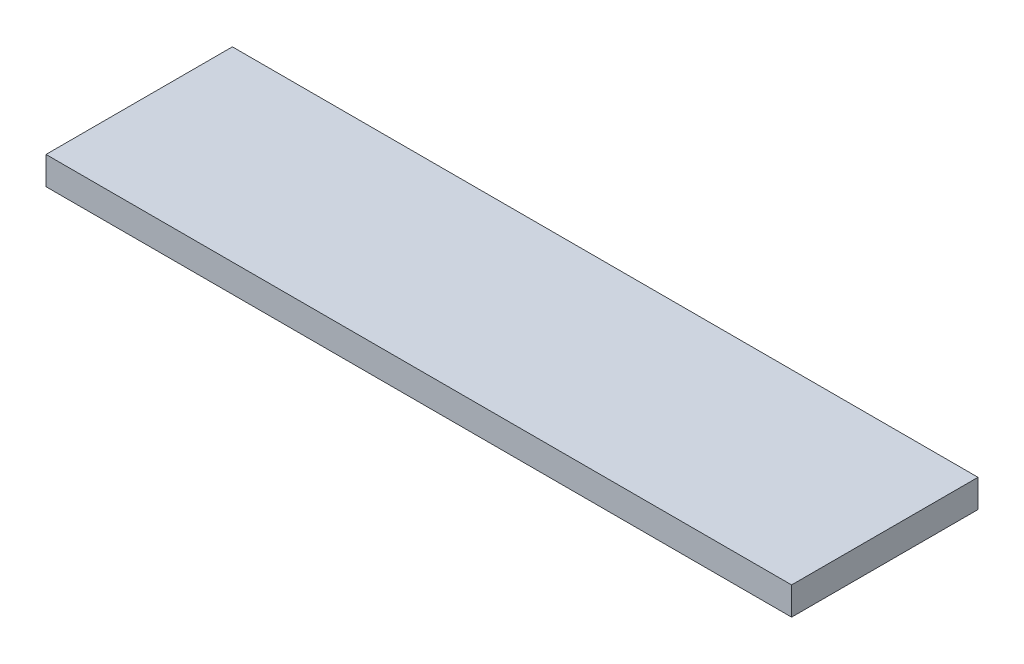
ISO-10303-21;
HEADER;
FILE_DESCRIPTION(('STEP AP214'),'2;1');
FILE_NAME('part.step','',(''),(''),'','','');
FILE_SCHEMA(('AUTOMOTIVE_DESIGN { 1 0 10303 214 1 1 1 1 }'));
ENDSEC;
DATA;
#1=APPLICATION_CONTEXT('core data for automotive mechanical design processes');
#2=APPLICATION_PROTOCOL_DEFINITION('international standard','automotive_design',2000,#1);
#3=PRODUCT_CONTEXT('',#1,'mechanical');
#4=PRODUCT('Part','Part','',(#3));
#5=PRODUCT_RELATED_PRODUCT_CATEGORY('part','',(#4));
#6=PRODUCT_DEFINITION_FORMATION('','',#4);
#7=PRODUCT_DEFINITION_CONTEXT('part definition',#1,'design');
#8=PRODUCT_DEFINITION('design','',#6,#7);
#9=PRODUCT_DEFINITION_SHAPE('','',#8);
#10=(LENGTH_UNIT() NAMED_UNIT(*) SI_UNIT(.MILLI.,.METRE.));
#11=(NAMED_UNIT(*) PLANE_ANGLE_UNIT() SI_UNIT($,.RADIAN.));
#12=(NAMED_UNIT(*) SI_UNIT($,.STERADIAN.) SOLID_ANGLE_UNIT());
#13=UNCERTAINTY_MEASURE_WITH_UNIT(LENGTH_MEASURE(1.E-05),#10,'distance_accuracy_value','');
#14=(GEOMETRIC_REPRESENTATION_CONTEXT(3) GLOBAL_UNCERTAINTY_ASSIGNED_CONTEXT((#13)) GLOBAL_UNIT_ASSIGNED_CONTEXT((#10,
#11,#12)) REPRESENTATION_CONTEXT('',''));
#15=CARTESIAN_POINT('',(0.,0.,0.));
#16=DIRECTION('',(0.,0.,1.));
#17=DIRECTION('',(1.,0.,0.));
#18=AXIS2_PLACEMENT_3D('',#15,#16,#17);
#19=CARTESIAN_POINT('',(-200.,15.,50.));
#20=DIRECTION('',(1.,0.,0.));
#21=DIRECTION('',(0.,0.,-1.));
#22=AXIS2_PLACEMENT_3D('',#19,#20,#21);
#23=PLANE('',#22);
#24=DIRECTION('',(0.,0.,1.));
#25=VECTOR('',#24,1.);
#26=CARTESIAN_POINT('',(-200.,0.,50.));
#27=LINE('',#26,#25);
#28=CARTESIAN_POINT('',(-200.,0.,-50.));
#29=VERTEX_POINT('',#28);
#30=CARTESIAN_POINT('',(-200.,0.,50.));
#31=VERTEX_POINT('',#30);
#32=EDGE_CURVE('E100',#29,#31,#27,.T.);
#33=ORIENTED_EDGE('',*,*,#32,.T.);
#34=DIRECTION('',(0.,-1.,0.));
#35=VECTOR('',#34,1.);
#36=CARTESIAN_POINT('',(-200.,15.,50.));
#37=LINE('',#36,#35);
#38=CARTESIAN_POINT('',(-200.,15.,50.));
#39=VERTEX_POINT('',#38);
#40=EDGE_CURVE('E11',#39,#31,#37,.T.);
#41=ORIENTED_EDGE('',*,*,#40,.F.);
#42=DIRECTION('',(0.,0.,1.));
#43=VECTOR('',#42,1.);
#44=CARTESIAN_POINT('',(-200.,15.,50.));
#45=LINE('',#44,#43);
#46=CARTESIAN_POINT('',(-200.,15.,-50.));
#47=VERTEX_POINT('',#46);
#48=EDGE_CURVE('E88',#47,#39,#45,.T.);
#49=ORIENTED_EDGE('',*,*,#48,.F.);
#50=DIRECTION('',(0.,-1.,0.));
#51=VECTOR('',#50,1.);
#52=CARTESIAN_POINT('',(-200.,15.,-50.));
#53=LINE('',#52,#51);
#54=EDGE_CURVE('E96',#47,#29,#53,.T.);
#55=ORIENTED_EDGE('',*,*,#54,.T.);
#56=EDGE_LOOP('',(#33,#41,#49,#55));
#57=FACE_BOUND('',#56,.T.);
#58=ADVANCED_FACE('F37',(#57),#23,.F.);
#59=CARTESIAN_POINT('',(200.,15.,50.));
#60=DIRECTION('',(0.,0.,-1.));
#61=DIRECTION('',(-1.,0.,0.));
#62=AXIS2_PLACEMENT_3D('',#59,#60,#61);
#63=PLANE('',#62);
#64=DIRECTION('',(1.,0.,0.));
#65=VECTOR('',#64,1.);
#66=CARTESIAN_POINT('',(200.,0.,50.));
#67=LINE('',#66,#65);
#68=CARTESIAN_POINT('',(200.,0.,50.));
#69=VERTEX_POINT('',#68);
#70=EDGE_CURVE('E92',#31,#69,#67,.T.);
#71=ORIENTED_EDGE('',*,*,#70,.T.);
#72=DIRECTION('',(0.,-1.,0.));
#73=VECTOR('',#72,1.);
#74=CARTESIAN_POINT('',(200.,15.,50.));
#75=LINE('',#74,#73);
#76=CARTESIAN_POINT('',(200.,15.,50.));
#77=VERTEX_POINT('',#76);
#78=EDGE_CURVE('E45',#77,#69,#75,.T.);
#79=ORIENTED_EDGE('',*,*,#78,.F.);
#80=DIRECTION('',(1.,0.,0.));
#81=VECTOR('',#80,1.);
#82=CARTESIAN_POINT('',(200.,15.,50.));
#83=LINE('',#82,#81);
#84=EDGE_CURVE('E83',#39,#77,#83,.T.);
#85=ORIENTED_EDGE('',*,*,#84,.F.);
#86=ORIENTED_EDGE('',*,*,#40,.T.);
#87=EDGE_LOOP('',(#71,#79,#85,#86));
#88=FACE_BOUND('',#87,.T.);
#89=ADVANCED_FACE('F91',(#88),#63,.F.);
#90=CARTESIAN_POINT('',(200.,15.,50.));
#91=DIRECTION('',(-1.,0.,0.));
#92=DIRECTION('',(0.,0.,1.));
#93=AXIS2_PLACEMENT_3D('',#90,#91,#92);
#94=PLANE('',#93);
#95=DIRECTION('',(0.,0.,-1.));
#96=VECTOR('',#95,1.);
#97=CARTESIAN_POINT('',(200.,0.,50.));
#98=LINE('',#97,#96);
#99=CARTESIAN_POINT('',(200.,0.,-50.0000000000001));
#100=VERTEX_POINT('',#99);
#101=EDGE_CURVE('E70',#69,#100,#98,.T.);
#102=ORIENTED_EDGE('',*,*,#101,.T.);
#103=DIRECTION('',(0.,-1.,0.));
#104=VECTOR('',#103,1.);
#105=CARTESIAN_POINT('',(200.,15.,-50.0000000000001));
#106=LINE('',#105,#104);
#107=CARTESIAN_POINT('',(200.,15.,-50.0000000000001));
#108=VERTEX_POINT('',#107);
#109=EDGE_CURVE('E93',#108,#100,#106,.T.);
#110=ORIENTED_EDGE('',*,*,#109,.F.);
#111=DIRECTION('',(0.,0.,-1.));
#112=VECTOR('',#111,1.);
#113=CARTESIAN_POINT('',(200.,15.,50.));
#114=LINE('',#113,#112);
#115=EDGE_CURVE('E86',#77,#108,#114,.T.);
#116=ORIENTED_EDGE('',*,*,#115,.F.);
#117=ORIENTED_EDGE('',*,*,#78,.T.);
#118=EDGE_LOOP('',(#102,#110,#116,#117));
#119=FACE_BOUND('',#118,.T.);
#120=ADVANCED_FACE('F94',(#119),#94,.F.);
#121=CARTESIAN_POINT('',(200.,15.,-50.0000000000001));
#122=DIRECTION('',(0.,0.,1.));
#123=DIRECTION('',(1.,0.,0.));
#124=AXIS2_PLACEMENT_3D('',#121,#122,#123);
#125=PLANE('',#124);
#126=DIRECTION('',(-1.,0.,0.));
#127=VECTOR('',#126,1.);
#128=CARTESIAN_POINT('',(200.,0.,-50.0000000000001));
#129=LINE('',#128,#127);
#130=EDGE_CURVE('E76',#100,#29,#129,.T.);
#131=ORIENTED_EDGE('',*,*,#130,.T.);
#132=ORIENTED_EDGE('',*,*,#54,.F.);
#133=DIRECTION('',(-1.,0.,0.));
#134=VECTOR('',#133,1.);
#135=CARTESIAN_POINT('',(200.,15.,-50.0000000000001));
#136=LINE('',#135,#134);
#137=EDGE_CURVE('E53',#108,#47,#136,.T.);
#138=ORIENTED_EDGE('',*,*,#137,.F.);
#139=ORIENTED_EDGE('',*,*,#109,.T.);
#140=EDGE_LOOP('',(#131,#132,#138,#139));
#141=FACE_BOUND('',#140,.T.);
#142=ADVANCED_FACE('F107',(#141),#125,.F.);
#143=CARTESIAN_POINT('',(0.,15.,0.));
#144=DIRECTION('',(0.,1.,0.));
#145=DIRECTION('',(0.,0.,1.));
#146=AXIS2_PLACEMENT_3D('',#143,#144,#145);
#147=PLANE('',#146);
#148=ORIENTED_EDGE('',*,*,#48,.T.);
#149=ORIENTED_EDGE('',*,*,#84,.T.);
#150=ORIENTED_EDGE('',*,*,#115,.T.);
#151=ORIENTED_EDGE('',*,*,#137,.T.);
#152=EDGE_LOOP('',(#148,#149,#150,#151));
#153=FACE_BOUND('',#152,.T.);
#154=ADVANCED_FACE('F84',(#153),#147,.T.);
#155=CARTESIAN_POINT('',(0.,0.,0.));
#156=DIRECTION('',(0.,1.,0.));
#157=DIRECTION('',(0.,0.,1.));
#158=AXIS2_PLACEMENT_3D('',#155,#156,#157);
#159=PLANE('',#158);
#160=ORIENTED_EDGE('',*,*,#32,.F.);
#161=ORIENTED_EDGE('',*,*,#130,.F.);
#162=ORIENTED_EDGE('',*,*,#101,.F.);
#163=ORIENTED_EDGE('',*,*,#70,.F.);
#164=EDGE_LOOP('',(#160,#161,#162,#163));
#165=FACE_BOUND('',#164,.T.);
#166=ADVANCED_FACE('F110',(#165),#159,.F.);
#167=CLOSED_SHELL('',(#58,#89,#120,#142,#154,#166));
#168=MANIFOLD_SOLID_BREP('B2',#167);
#169=ADVANCED_BREP_SHAPE_REPRESENTATION('',(#18,#168),#14);
#170=SHAPE_DEFINITION_REPRESENTATION(#9,#169);
ENDSEC;
END-ISO-10303-21;
